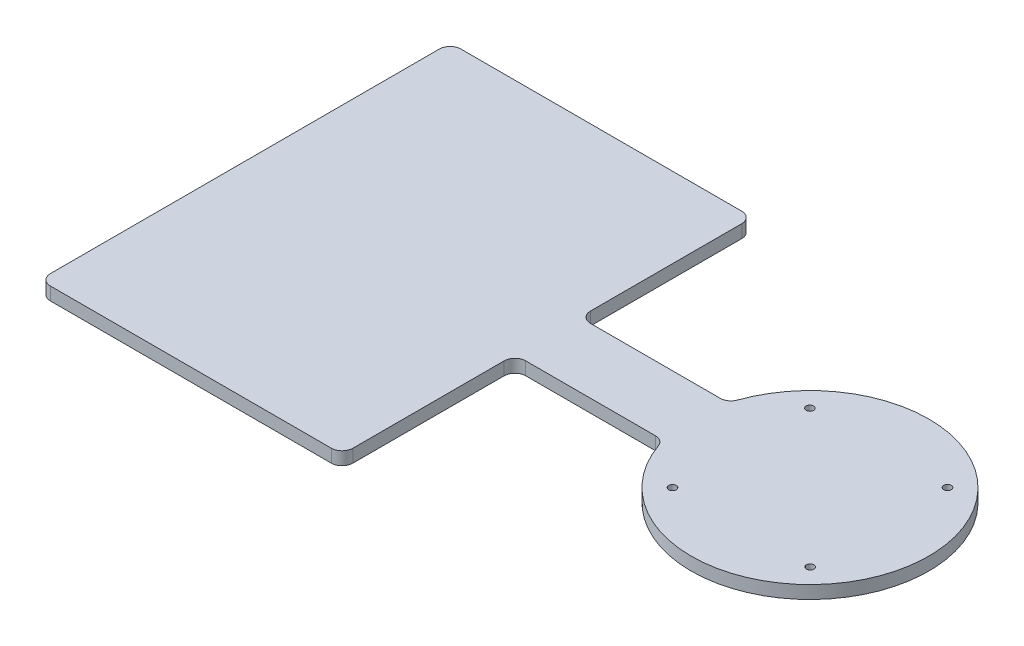
ISO-10303-21;
HEADER;
FILE_DESCRIPTION(('STEP AP214'),'2;1');
FILE_NAME('part.step','',(''),(''),'','','');
FILE_SCHEMA(('AUTOMOTIVE_DESIGN { 1 0 10303 214 1 1 1 1 }'));
ENDSEC;
DATA;
#1=APPLICATION_CONTEXT('core data for automotive mechanical design processes');
#2=APPLICATION_PROTOCOL_DEFINITION('international standard','automotive_design',2000,#1);
#3=PRODUCT_CONTEXT('',#1,'mechanical');
#4=PRODUCT('Part','Part','',(#3));
#5=PRODUCT_RELATED_PRODUCT_CATEGORY('part','',(#4));
#6=PRODUCT_DEFINITION_FORMATION('','',#4);
#7=PRODUCT_DEFINITION_CONTEXT('part definition',#1,'design');
#8=PRODUCT_DEFINITION('design','',#6,#7);
#9=PRODUCT_DEFINITION_SHAPE('','',#8);
#10=(LENGTH_UNIT() NAMED_UNIT(*) SI_UNIT(.MILLI.,.METRE.));
#11=(NAMED_UNIT(*) PLANE_ANGLE_UNIT() SI_UNIT($,.RADIAN.));
#12=(NAMED_UNIT(*) SI_UNIT($,.STERADIAN.) SOLID_ANGLE_UNIT());
#13=UNCERTAINTY_MEASURE_WITH_UNIT(LENGTH_MEASURE(1.E-05),#10,'distance_accuracy_value','');
#14=(GEOMETRIC_REPRESENTATION_CONTEXT(3) GLOBAL_UNCERTAINTY_ASSIGNED_CONTEXT((#13)) GLOBAL_UNIT_ASSIGNED_CONTEXT((#10,
#11,#12)) REPRESENTATION_CONTEXT('',''));
#15=CARTESIAN_POINT('',(0.,0.,0.));
#16=DIRECTION('',(0.,0.,1.));
#17=DIRECTION('',(1.,0.,0.));
#18=AXIS2_PLACEMENT_3D('',#15,#16,#17);
#19=CARTESIAN_POINT('',(-56.568542494923,6.,-19.9999999999996));
#20=DIRECTION('',(0.,-1.,0.));
#21=DIRECTION('',(0.,0.,-1.));
#22=AXIS2_PLACEMENT_3D('',#19,#20,#21);
#23=PLANE('',#22);
#24=CARTESIAN_POINT('',(-56.568542494923,6.,-19.9999999999996));
#25=DIRECTION('',(0.,-1.,0.));
#26=DIRECTION('',(0.,0.,-1.));
#27=AXIS2_PLACEMENT_3D('',#24,#25,#26);
#28=CIRCLE('',#27,5.);
#29=CARTESIAN_POINT('',(-51.8544972870131,6.,-18.3333333333331));
#30=VERTEX_POINT('',#29);
#31=CARTESIAN_POINT('',(-56.568542494923,6.,-14.9999999999996));
#32=VERTEX_POINT('',#31);
#33=EDGE_CURVE('E213',#30,#32,#28,.T.);
#34=ORIENTED_EDGE('',*,*,#33,.T.);
#35=DIRECTION('',(-1.,0.,0.));
#36=VECTOR('',#35,1.);
#37=CARTESIAN_POINT('',(-56.568542494923,6.,-14.9999999999996));
#38=LINE('',#37,#36);
#39=CARTESIAN_POINT('',(-116.568542494924,6.,-14.9999999999992));
#40=VERTEX_POINT('',#39);
#41=EDGE_CURVE('E121',#32,#40,#38,.T.);
#42=ORIENTED_EDGE('',*,*,#41,.T.);
#43=CARTESIAN_POINT('',(-116.568542494924,6.,-19.9999999999992));
#44=DIRECTION('',(0.,-1.,0.));
#45=DIRECTION('',(0.,0.,1.));
#46=AXIS2_PLACEMENT_3D('',#43,#44,#45);
#47=CIRCLE('',#46,5.);
#48=CARTESIAN_POINT('',(-121.568542494924,6.,-19.9999999999991));
#49=VERTEX_POINT('',#48);
#50=EDGE_CURVE('E252',#40,#49,#47,.T.);
#51=ORIENTED_EDGE('',*,*,#50,.T.);
#52=DIRECTION('',(0.,0.,-1.));
#53=VECTOR('',#52,1.);
#54=CARTESIAN_POINT('',(-121.568542494924,6.,-19.9999999999991));
#55=LINE('',#54,#53);
#56=CARTESIAN_POINT('',(-121.568542494924,6.,-89.9999999999991));
#57=VERTEX_POINT('',#56);
#58=EDGE_CURVE('E271',#49,#57,#55,.T.);
#59=ORIENTED_EDGE('',*,*,#58,.T.);
#60=CARTESIAN_POINT('',(-126.568542494924,6.,-89.9999999999991));
#61=DIRECTION('',(0.,1.,0.));
#62=DIRECTION('',(0.,0.,-1.));
#63=AXIS2_PLACEMENT_3D('',#60,#61,#62);
#64=CIRCLE('',#63,5.);
#65=CARTESIAN_POINT('',(-126.568542494924,6.,-94.9999999999991));
#66=VERTEX_POINT('',#65);
#67=EDGE_CURVE('E268',#57,#66,#64,.T.);
#68=ORIENTED_EDGE('',*,*,#67,.T.);
#69=DIRECTION('',(-1.,0.,0.));
#70=VECTOR('',#69,1.);
#71=CARTESIAN_POINT('',(-126.568542494924,6.,-94.9999999999991));
#72=LINE('',#71,#70);
#73=CARTESIAN_POINT('',(-256.568542494924,6.,-94.9999999999982));
#74=VERTEX_POINT('',#73);
#75=EDGE_CURVE('E270',#66,#74,#72,.T.);
#76=ORIENTED_EDGE('',*,*,#75,.T.);
#77=CARTESIAN_POINT('',(-256.568542494924,6.,-89.9999999999982));
#78=DIRECTION('',(0.,1.,0.));
#79=DIRECTION('',(0.,0.,1.));
#80=AXIS2_PLACEMENT_3D('',#77,#78,#79);
#81=CIRCLE('',#80,5.);
#82=CARTESIAN_POINT('',(-261.568542494924,6.,-89.9999999999982));
#83=VERTEX_POINT('',#82);
#84=EDGE_CURVE('E273',#74,#83,#81,.T.);
#85=ORIENTED_EDGE('',*,*,#84,.T.);
#86=DIRECTION('',(0.,0.,1.));
#87=VECTOR('',#86,1.);
#88=CARTESIAN_POINT('',(-261.568542494923,6.,90.0000000000018));
#89=LINE('',#88,#87);
#90=CARTESIAN_POINT('',(-261.568542494923,6.,90.0000000000018));
#91=VERTEX_POINT('',#90);
#92=EDGE_CURVE('E279',#83,#91,#89,.T.);
#93=ORIENTED_EDGE('',*,*,#92,.T.);
#94=CARTESIAN_POINT('',(-256.568542494923,6.,90.0000000000018));
#95=DIRECTION('',(0.,1.,0.));
#96=DIRECTION('',(0.,0.,-1.));
#97=AXIS2_PLACEMENT_3D('',#94,#95,#96);
#98=CIRCLE('',#97,5.);
#99=CARTESIAN_POINT('',(-256.568542494923,6.,95.0000000000018));
#100=VERTEX_POINT('',#99);
#101=EDGE_CURVE('E281',#91,#100,#98,.T.);
#102=ORIENTED_EDGE('',*,*,#101,.T.);
#103=DIRECTION('',(1.,0.,0.));
#104=VECTOR('',#103,1.);
#105=CARTESIAN_POINT('',(-126.568542494923,6.,95.));
#106=LINE('',#105,#104);
#107=CARTESIAN_POINT('',(-126.568542494923,6.,95.0000000000004));
#108=VERTEX_POINT('',#107);
#109=EDGE_CURVE('E283',#100,#108,#106,.T.);
#110=ORIENTED_EDGE('',*,*,#109,.T.);
#111=CARTESIAN_POINT('',(-126.568542494923,6.,90.0000000000009));
#112=DIRECTION('',(0.,1.,0.));
#113=DIRECTION('',(0.,0.,1.));
#114=AXIS2_PLACEMENT_3D('',#111,#112,#113);
#115=CIRCLE('',#114,4.99999999999954);
#116=CARTESIAN_POINT('',(-121.568542494923,6.,90.));
#117=VERTEX_POINT('',#116);
#118=EDGE_CURVE('E285',#108,#117,#115,.T.);
#119=ORIENTED_EDGE('',*,*,#118,.T.);
#120=DIRECTION('',(0.,0.,-1.));
#121=VECTOR('',#120,1.);
#122=CARTESIAN_POINT('',(-121.568542494924,6.,20.));
#123=LINE('',#122,#121);
#124=CARTESIAN_POINT('',(-121.568542494924,6.,20.));
#125=VERTEX_POINT('',#124);
#126=EDGE_CURVE('E287',#117,#125,#123,.T.);
#127=ORIENTED_EDGE('',*,*,#126,.T.);
#128=CARTESIAN_POINT('',(-116.568542494924,6.,20.0000000000008));
#129=DIRECTION('',(0.,-1.,0.));
#130=DIRECTION('',(0.,0.,-1.));
#131=AXIS2_PLACEMENT_3D('',#128,#129,#130);
#132=CIRCLE('',#131,5.);
#133=CARTESIAN_POINT('',(-116.568542494924,6.,15.0000000000008));
#134=VERTEX_POINT('',#133);
#135=EDGE_CURVE('E164',#125,#134,#132,.T.);
#136=ORIENTED_EDGE('',*,*,#135,.T.);
#137=DIRECTION('',(1.,0.,0.));
#138=VECTOR('',#137,1.);
#139=CARTESIAN_POINT('',(-56.5685424949237,6.,15.0000000000004));
#140=LINE('',#139,#138);
#141=CARTESIAN_POINT('',(-56.5685424949237,6.,15.0000000000004));
#142=VERTEX_POINT('',#141);
#143=EDGE_CURVE('E158',#134,#142,#140,.T.);
#144=ORIENTED_EDGE('',*,*,#143,.T.);
#145=CARTESIAN_POINT('',(-56.5685424949237,6.,20.0000000000004));
#146=DIRECTION('',(0.,-1.,0.));
#147=DIRECTION('',(0.,0.,1.));
#148=AXIS2_PLACEMENT_3D('',#145,#146,#147);
#149=CIRCLE('',#148,5.);
#150=CARTESIAN_POINT('',(-51.854497287013,6.,18.3333333333335));
#151=VERTEX_POINT('',#150);
#152=EDGE_CURVE('E162',#142,#151,#149,.T.);
#153=ORIENTED_EDGE('',*,*,#152,.T.);
#154=CARTESIAN_POINT('',(0.,6.,0.));
#155=DIRECTION('',(0.,1.,0.));
#156=DIRECTION('',(0.,0.,1.));
#157=AXIS2_PLACEMENT_3D('',#154,#155,#156);
#158=CIRCLE('',#157,54.9999999999996);
#159=EDGE_CURVE('E54',#151,#30,#158,.T.);
#160=ORIENTED_EDGE('',*,*,#159,.T.);
#161=EDGE_LOOP('',(#34,#42,#51,#59,#68,#76,#85,#93,#102,#110,#119,#127,#136,#144,#153,#160));
#162=FACE_BOUND('',#161,.T.);
#163=CARTESIAN_POINT('',(31.8512721961785,6.,31.7883069616007));
#164=DIRECTION('',(0.,1.,0.));
#165=DIRECTION('',(0.,0.,1.));
#166=AXIS2_PLACEMENT_3D('',#163,#164,#165);
#167=CIRCLE('',#166,1.75);
#168=CARTESIAN_POINT('',(31.8512721961785,6.,33.5383069616007));
#169=VERTEX_POINT('',#168);
#170=EDGE_CURVE('E186',#169,#169,#167,.T.);
#171=ORIENTED_EDGE('',*,*,#170,.F.);
#172=EDGE_LOOP('',(#171));
#173=FACE_BOUND('',#172,.T.);
#174=CARTESIAN_POINT('',(31.788306961597,6.,-31.8512721961785));
#175=DIRECTION('',(0.,1.,0.));
#176=DIRECTION('',(0.,0.,1.));
#177=AXIS2_PLACEMENT_3D('',#174,#175,#176);
#178=CIRCLE('',#177,1.75000000000093);
#179=CARTESIAN_POINT('',(31.788306961597,6.,-30.1012721961775));
#180=VERTEX_POINT('',#179);
#181=EDGE_CURVE('E351',#180,#180,#178,.T.);
#182=ORIENTED_EDGE('',*,*,#181,.F.);
#183=EDGE_LOOP('',(#182));
#184=FACE_BOUND('',#183,.T.);
#185=CARTESIAN_POINT('',(-31.8512721961821,6.,-31.788306961597));
#186=DIRECTION('',(0.,1.,0.));
#187=DIRECTION('',(0.,0.,1.));
#188=AXIS2_PLACEMENT_3D('',#185,#186,#187);
#189=CIRCLE('',#188,1.75000000000425);
#190=CARTESIAN_POINT('',(-31.8512721961821,6.,-30.0383069615928));
#191=VERTEX_POINT('',#190);
#192=EDGE_CURVE('E345',#191,#191,#189,.T.);
#193=ORIENTED_EDGE('',*,*,#192,.F.);
#194=EDGE_LOOP('',(#193));
#195=FACE_BOUND('',#194,.T.);
#196=CARTESIAN_POINT('',(-31.7883069616007,6.,31.8512721961821));
#197=DIRECTION('',(0.,1.,0.));
#198=DIRECTION('',(0.,0.,1.));
#199=AXIS2_PLACEMENT_3D('',#196,#197,#198);
#200=CIRCLE('',#199,1.75000000000306);
#201=CARTESIAN_POINT('',(-31.7883069616007,6.,33.6012721961851));
#202=VERTEX_POINT('',#201);
#203=EDGE_CURVE('E336',#202,#202,#200,.T.);
#204=ORIENTED_EDGE('',*,*,#203,.F.);
#205=EDGE_LOOP('',(#204));
#206=FACE_BOUND('',#205,.T.);
#207=ADVANCED_FACE('F37',(#162,#173,#184,#195,#206),#23,.F.);
#208=CARTESIAN_POINT('',(-56.568542494923,0.,-19.9999999999996));
#209=DIRECTION('',(0.,-1.,0.));
#210=DIRECTION('',(0.,0.,-1.));
#211=AXIS2_PLACEMENT_3D('',#208,#209,#210);
#212=PLANE('',#211);
#213=CARTESIAN_POINT('',(-31.8512721961821,0.,-31.788306961597));
#214=DIRECTION('',(0.,1.,0.));
#215=DIRECTION('',(0.,0.,1.));
#216=AXIS2_PLACEMENT_3D('',#213,#214,#215);
#217=CIRCLE('',#216,1.75000000000425);
#218=CARTESIAN_POINT('',(-31.8512721961821,0.,-30.0383069615928));
#219=VERTEX_POINT('',#218);
#220=EDGE_CURVE('E342',#219,#219,#217,.T.);
#221=ORIENTED_EDGE('',*,*,#220,.T.);
#222=EDGE_LOOP('',(#221));
#223=FACE_BOUND('',#222,.T.);
#224=CARTESIAN_POINT('',(31.8512721961785,0.,31.7883069616007));
#225=DIRECTION('',(0.,1.,0.));
#226=DIRECTION('',(0.,0.,1.));
#227=AXIS2_PLACEMENT_3D('',#224,#225,#226);
#228=CIRCLE('',#227,1.75);
#229=CARTESIAN_POINT('',(31.8512721961785,0.,33.5383069616007));
#230=VERTEX_POINT('',#229);
#231=EDGE_CURVE('E354',#230,#230,#228,.T.);
#232=ORIENTED_EDGE('',*,*,#231,.T.);
#233=EDGE_LOOP('',(#232));
#234=FACE_BOUND('',#233,.T.);
#235=CARTESIAN_POINT('',(-56.568542494923,0.,-19.9999999999996));
#236=DIRECTION('',(0.,-1.,0.));
#237=DIRECTION('',(0.,0.,-1.));
#238=AXIS2_PLACEMENT_3D('',#235,#236,#237);
#239=CIRCLE('',#238,5.);
#240=CARTESIAN_POINT('',(-51.8544972870131,0.,-18.3333333333331));
#241=VERTEX_POINT('',#240);
#242=CARTESIAN_POINT('',(-56.568542494923,0.,-14.9999999999996));
#243=VERTEX_POINT('',#242);
#244=EDGE_CURVE('E182',#241,#243,#239,.T.);
#245=ORIENTED_EDGE('',*,*,#244,.F.);
#246=CARTESIAN_POINT('',(0.,0.,0.));
#247=DIRECTION('',(0.,1.,0.));
#248=DIRECTION('',(0.,0.,1.));
#249=AXIS2_PLACEMENT_3D('',#246,#247,#248);
#250=CIRCLE('',#249,54.9999999999996);
#251=CARTESIAN_POINT('',(-51.854497287013,0.,18.3333333333335));
#252=VERTEX_POINT('',#251);
#253=EDGE_CURVE('E113',#252,#241,#250,.T.);
#254=ORIENTED_EDGE('',*,*,#253,.F.);
#255=CARTESIAN_POINT('',(-56.5685424949237,0.,20.0000000000004));
#256=DIRECTION('',(0.,-1.,0.));
#257=DIRECTION('',(0.,0.,1.));
#258=AXIS2_PLACEMENT_3D('',#255,#256,#257);
#259=CIRCLE('',#258,5.);
#260=CARTESIAN_POINT('',(-56.5685424949237,0.,15.0000000000004));
#261=VERTEX_POINT('',#260);
#262=EDGE_CURVE('E107',#261,#252,#259,.T.);
#263=ORIENTED_EDGE('',*,*,#262,.F.);
#264=DIRECTION('',(1.,0.,0.));
#265=VECTOR('',#264,1.);
#266=CARTESIAN_POINT('',(-56.5685424949237,0.,15.0000000000004));
#267=LINE('',#266,#265);
#268=CARTESIAN_POINT('',(-116.568542494924,0.,15.0000000000008));
#269=VERTEX_POINT('',#268);
#270=EDGE_CURVE('E172',#269,#261,#267,.T.);
#271=ORIENTED_EDGE('',*,*,#270,.F.);
#272=CARTESIAN_POINT('',(-116.568542494924,0.,20.0000000000008));
#273=DIRECTION('',(0.,-1.,0.));
#274=DIRECTION('',(0.,0.,-1.));
#275=AXIS2_PLACEMENT_3D('',#272,#273,#274);
#276=CIRCLE('',#275,5.);
#277=CARTESIAN_POINT('',(-121.568542494924,0.,20.));
#278=VERTEX_POINT('',#277);
#279=EDGE_CURVE('E208',#278,#269,#276,.T.);
#280=ORIENTED_EDGE('',*,*,#279,.F.);
#281=DIRECTION('',(0.,0.,-1.));
#282=VECTOR('',#281,1.);
#283=CARTESIAN_POINT('',(-121.568542494924,0.,20.));
#284=LINE('',#283,#282);
#285=CARTESIAN_POINT('',(-121.568542494923,0.,90.));
#286=VERTEX_POINT('',#285);
#287=EDGE_CURVE('E206',#286,#278,#284,.T.);
#288=ORIENTED_EDGE('',*,*,#287,.F.);
#289=CARTESIAN_POINT('',(-126.568542494923,0.,90.0000000000009));
#290=DIRECTION('',(0.,1.,0.));
#291=DIRECTION('',(0.,0.,1.));
#292=AXIS2_PLACEMENT_3D('',#289,#290,#291);
#293=CIRCLE('',#292,4.99999999999954);
#294=CARTESIAN_POINT('',(-126.568542494923,0.,95.0000000000004));
#295=VERTEX_POINT('',#294);
#296=EDGE_CURVE('E204',#295,#286,#293,.T.);
#297=ORIENTED_EDGE('',*,*,#296,.F.);
#298=DIRECTION('',(1.,0.,0.));
#299=VECTOR('',#298,1.);
#300=CARTESIAN_POINT('',(-126.568542494923,0.,95.));
#301=LINE('',#300,#299);
#302=CARTESIAN_POINT('',(-256.568542494923,0.,95.0000000000018));
#303=VERTEX_POINT('',#302);
#304=EDGE_CURVE('E202',#303,#295,#301,.T.);
#305=ORIENTED_EDGE('',*,*,#304,.F.);
#306=CARTESIAN_POINT('',(-256.568542494923,0.,90.0000000000018));
#307=DIRECTION('',(0.,1.,0.));
#308=DIRECTION('',(0.,0.,-1.));
#309=AXIS2_PLACEMENT_3D('',#306,#307,#308);
#310=CIRCLE('',#309,5.);
#311=CARTESIAN_POINT('',(-261.568542494923,0.,90.0000000000018));
#312=VERTEX_POINT('',#311);
#313=EDGE_CURVE('E200',#312,#303,#310,.T.);
#314=ORIENTED_EDGE('',*,*,#313,.F.);
#315=DIRECTION('',(0.,0.,1.));
#316=VECTOR('',#315,1.);
#317=CARTESIAN_POINT('',(-261.568542494923,0.,90.0000000000018));
#318=LINE('',#317,#316);
#319=CARTESIAN_POINT('',(-261.568542494924,0.,-89.9999999999982));
#320=VERTEX_POINT('',#319);
#321=EDGE_CURVE('E198',#320,#312,#318,.T.);
#322=ORIENTED_EDGE('',*,*,#321,.F.);
#323=CARTESIAN_POINT('',(-256.568542494924,0.,-89.9999999999982));
#324=DIRECTION('',(0.,1.,0.));
#325=DIRECTION('',(0.,0.,1.));
#326=AXIS2_PLACEMENT_3D('',#323,#324,#325);
#327=CIRCLE('',#326,5.);
#328=CARTESIAN_POINT('',(-256.568542494924,0.,-94.9999999999982));
#329=VERTEX_POINT('',#328);
#330=EDGE_CURVE('E196',#329,#320,#327,.T.);
#331=ORIENTED_EDGE('',*,*,#330,.F.);
#332=DIRECTION('',(-1.,0.,0.));
#333=VECTOR('',#332,1.);
#334=CARTESIAN_POINT('',(-126.568542494924,0.,-94.9999999999991));
#335=LINE('',#334,#333);
#336=CARTESIAN_POINT('',(-126.568542494924,0.,-94.9999999999991));
#337=VERTEX_POINT('',#336);
#338=EDGE_CURVE('E194',#337,#329,#335,.T.);
#339=ORIENTED_EDGE('',*,*,#338,.F.);
#340=CARTESIAN_POINT('',(-126.568542494924,0.,-89.9999999999991));
#341=DIRECTION('',(0.,1.,0.));
#342=DIRECTION('',(0.,0.,-1.));
#343=AXIS2_PLACEMENT_3D('',#340,#341,#342);
#344=CIRCLE('',#343,5.);
#345=CARTESIAN_POINT('',(-121.568542494924,0.,-89.9999999999991));
#346=VERTEX_POINT('',#345);
#347=EDGE_CURVE('E192',#346,#337,#344,.T.);
#348=ORIENTED_EDGE('',*,*,#347,.F.);
#349=DIRECTION('',(0.,0.,-1.));
#350=VECTOR('',#349,1.);
#351=CARTESIAN_POINT('',(-121.568542494924,0.,-19.9999999999991));
#352=LINE('',#351,#350);
#353=CARTESIAN_POINT('',(-121.568542494924,0.,-19.9999999999991));
#354=VERTEX_POINT('',#353);
#355=EDGE_CURVE('E190',#354,#346,#352,.T.);
#356=ORIENTED_EDGE('',*,*,#355,.F.);
#357=CARTESIAN_POINT('',(-116.568542494924,0.,-19.9999999999992));
#358=DIRECTION('',(0.,-1.,0.));
#359=DIRECTION('',(0.,0.,1.));
#360=AXIS2_PLACEMENT_3D('',#357,#358,#359);
#361=CIRCLE('',#360,5.);
#362=CARTESIAN_POINT('',(-116.568542494924,0.,-14.9999999999992));
#363=VERTEX_POINT('',#362);
#364=EDGE_CURVE('E188',#363,#354,#361,.T.);
#365=ORIENTED_EDGE('',*,*,#364,.F.);
#366=DIRECTION('',(-1.,0.,0.));
#367=VECTOR('',#366,1.);
#368=CARTESIAN_POINT('',(-56.568542494923,0.,-14.9999999999996));
#369=LINE('',#368,#367);
#370=EDGE_CURVE('E185',#243,#363,#369,.T.);
#371=ORIENTED_EDGE('',*,*,#370,.F.);
#372=EDGE_LOOP('',(#245,#254,#263,#271,#280,#288,#297,#305,#314,#322,#331,#339,#348,#356,#365,#371));
#373=FACE_BOUND('',#372,.T.);
#374=CARTESIAN_POINT('',(31.788306961597,0.,-31.8512721961785));
#375=DIRECTION('',(0.,1.,0.));
#376=DIRECTION('',(0.,0.,1.));
#377=AXIS2_PLACEMENT_3D('',#374,#375,#376);
#378=CIRCLE('',#377,1.75000000000093);
#379=CARTESIAN_POINT('',(31.788306961597,0.,-30.1012721961775));
#380=VERTEX_POINT('',#379);
#381=EDGE_CURVE('E348',#380,#380,#378,.T.);
#382=ORIENTED_EDGE('',*,*,#381,.T.);
#383=EDGE_LOOP('',(#382));
#384=FACE_BOUND('',#383,.T.);
#385=CARTESIAN_POINT('',(-31.7883069616007,0.,31.8512721961821));
#386=DIRECTION('',(0.,1.,0.));
#387=DIRECTION('',(0.,0.,1.));
#388=AXIS2_PLACEMENT_3D('',#385,#386,#387);
#389=CIRCLE('',#388,1.75000000000306);
#390=CARTESIAN_POINT('',(-31.7883069616007,0.,33.6012721961851));
#391=VERTEX_POINT('',#390);
#392=EDGE_CURVE('E339',#391,#391,#389,.T.);
#393=ORIENTED_EDGE('',*,*,#392,.T.);
#394=EDGE_LOOP('',(#393));
#395=FACE_BOUND('',#394,.T.);
#396=ADVANCED_FACE('F256',(#223,#234,#373,#384,#395),#212,.T.);
#397=CARTESIAN_POINT('',(-56.568542494923,6.,-19.9999999999996));
#398=DIRECTION('',(0.,-1.,0.));
#399=DIRECTION('',(0.,0.,-1.));
#400=AXIS2_PLACEMENT_3D('',#397,#398,#399);
#401=CYLINDRICAL_SURFACE('',#400,5.);
#402=ORIENTED_EDGE('',*,*,#244,.T.);
#403=DIRECTION('',(0.,-1.,0.));
#404=VECTOR('',#403,1.);
#405=CARTESIAN_POINT('',(-56.568542494923,6.,-14.9999999999996));
#406=LINE('',#405,#404);
#407=EDGE_CURVE('E11',#32,#243,#406,.T.);
#408=ORIENTED_EDGE('',*,*,#407,.F.);
#409=ORIENTED_EDGE('',*,*,#33,.F.);
#410=DIRECTION('',(0.,-1.,0.));
#411=VECTOR('',#410,1.);
#412=CARTESIAN_POINT('',(-51.8544972870131,6.,-18.3333333333331));
#413=LINE('',#412,#411);
#414=EDGE_CURVE('E178',#30,#241,#413,.T.);
#415=ORIENTED_EDGE('',*,*,#414,.T.);
#416=EDGE_LOOP('',(#402,#408,#409,#415));
#417=FACE_BOUND('',#416,.T.);
#418=ADVANCED_FACE('F39',(#417),#401,.F.);
#419=CARTESIAN_POINT('',(-56.568542494923,6.,-14.9999999999996));
#420=DIRECTION('',(0.,0.,1.));
#421=DIRECTION('',(1.,0.,0.));
#422=AXIS2_PLACEMENT_3D('',#419,#420,#421);
#423=PLANE('',#422);
#424=ORIENTED_EDGE('',*,*,#370,.T.);
#425=DIRECTION('',(0.,-1.,0.));
#426=VECTOR('',#425,1.);
#427=CARTESIAN_POINT('',(-116.568542494924,6.,-14.9999999999992));
#428=LINE('',#427,#426);
#429=EDGE_CURVE('E46',#40,#363,#428,.T.);
#430=ORIENTED_EDGE('',*,*,#429,.F.);
#431=ORIENTED_EDGE('',*,*,#41,.F.);
#432=ORIENTED_EDGE('',*,*,#407,.T.);
#433=EDGE_LOOP('',(#424,#430,#431,#432));
#434=FACE_BOUND('',#433,.T.);
#435=ADVANCED_FACE('F520',(#434),#423,.F.);
#436=CARTESIAN_POINT('',(-116.568542494924,6.,-19.9999999999992));
#437=DIRECTION('',(0.,-1.,0.));
#438=DIRECTION('',(0.,0.,-1.));
#439=AXIS2_PLACEMENT_3D('',#436,#437,#438);
#440=CYLINDRICAL_SURFACE('',#439,5.);
#441=ORIENTED_EDGE('',*,*,#364,.T.);
#442=DIRECTION('',(0.,-1.,0.));
#443=VECTOR('',#442,1.);
#444=CARTESIAN_POINT('',(-121.568542494924,6.,-19.9999999999991));
#445=LINE('',#444,#443);
#446=EDGE_CURVE('E244',#49,#354,#445,.T.);
#447=ORIENTED_EDGE('',*,*,#446,.F.);
#448=ORIENTED_EDGE('',*,*,#50,.F.);
#449=ORIENTED_EDGE('',*,*,#429,.T.);
#450=EDGE_LOOP('',(#441,#447,#448,#449));
#451=FACE_BOUND('',#450,.T.);
#452=ADVANCED_FACE('F250',(#451),#440,.F.);
#453=CARTESIAN_POINT('',(-121.568542494924,6.,-19.9999999999991));
#454=DIRECTION('',(-1.,0.,0.));
#455=DIRECTION('',(0.,0.,1.));
#456=AXIS2_PLACEMENT_3D('',#453,#454,#455);
#457=PLANE('',#456);
#458=ORIENTED_EDGE('',*,*,#355,.T.);
#459=DIRECTION('',(0.,-1.,0.));
#460=VECTOR('',#459,1.);
#461=CARTESIAN_POINT('',(-121.568542494924,6.,-89.9999999999991));
#462=LINE('',#461,#460);
#463=EDGE_CURVE('E241',#57,#346,#462,.T.);
#464=ORIENTED_EDGE('',*,*,#463,.F.);
#465=ORIENTED_EDGE('',*,*,#58,.F.);
#466=ORIENTED_EDGE('',*,*,#446,.T.);
#467=EDGE_LOOP('',(#458,#464,#465,#466));
#468=FACE_BOUND('',#467,.T.);
#469=ADVANCED_FACE('F262',(#468),#457,.F.);
#470=CARTESIAN_POINT('',(-126.568542494924,6.,-89.9999999999991));
#471=DIRECTION('',(0.,-1.,0.));
#472=DIRECTION('',(0.,0.,-1.));
#473=AXIS2_PLACEMENT_3D('',#470,#471,#472);
#474=CYLINDRICAL_SURFACE('',#473,5.);
#475=ORIENTED_EDGE('',*,*,#347,.T.);
#476=DIRECTION('',(0.,-1.,0.));
#477=VECTOR('',#476,1.);
#478=CARTESIAN_POINT('',(-126.568542494924,6.,-94.9999999999991));
#479=LINE('',#478,#477);
#480=EDGE_CURVE('E238',#66,#337,#479,.T.);
#481=ORIENTED_EDGE('',*,*,#480,.F.);
#482=ORIENTED_EDGE('',*,*,#67,.F.);
#483=ORIENTED_EDGE('',*,*,#463,.T.);
#484=EDGE_LOOP('',(#475,#481,#482,#483));
#485=FACE_BOUND('',#484,.T.);
#486=ADVANCED_FACE('F266',(#485),#474,.T.);
#487=CARTESIAN_POINT('',(-126.568542494924,6.,-94.9999999999991));
#488=DIRECTION('',(0.,0.,1.));
#489=DIRECTION('',(1.,0.,0.));
#490=AXIS2_PLACEMENT_3D('',#487,#488,#489);
#491=PLANE('',#490);
#492=ORIENTED_EDGE('',*,*,#338,.T.);
#493=DIRECTION('',(0.,-1.,0.));
#494=VECTOR('',#493,1.);
#495=CARTESIAN_POINT('',(-256.568542494924,6.,-94.9999999999982));
#496=LINE('',#495,#494);
#497=EDGE_CURVE('E235',#74,#329,#496,.T.);
#498=ORIENTED_EDGE('',*,*,#497,.F.);
#499=ORIENTED_EDGE('',*,*,#75,.F.);
#500=ORIENTED_EDGE('',*,*,#480,.T.);
#501=EDGE_LOOP('',(#492,#498,#499,#500));
#502=FACE_BOUND('',#501,.T.);
#503=ADVANCED_FACE('F481',(#502),#491,.F.);
#504=CARTESIAN_POINT('',(-256.568542494924,6.,-89.9999999999982));
#505=DIRECTION('',(0.,-1.,0.));
#506=DIRECTION('',(0.,0.,-1.));
#507=AXIS2_PLACEMENT_3D('',#504,#505,#506);
#508=CYLINDRICAL_SURFACE('',#507,5.);
#509=ORIENTED_EDGE('',*,*,#330,.T.);
#510=DIRECTION('',(0.,-1.,0.));
#511=VECTOR('',#510,1.);
#512=CARTESIAN_POINT('',(-261.568542494924,6.,-89.9999999999982));
#513=LINE('',#512,#511);
#514=EDGE_CURVE('E232',#83,#320,#513,.T.);
#515=ORIENTED_EDGE('',*,*,#514,.F.);
#516=ORIENTED_EDGE('',*,*,#84,.F.);
#517=ORIENTED_EDGE('',*,*,#497,.T.);
#518=EDGE_LOOP('',(#509,#515,#516,#517));
#519=FACE_BOUND('',#518,.T.);
#520=ADVANCED_FACE('F470',(#519),#508,.T.);
#521=CARTESIAN_POINT('',(-261.568542494923,6.,90.0000000000018));
#522=DIRECTION('',(1.,0.,0.));
#523=DIRECTION('',(0.,0.,-1.));
#524=AXIS2_PLACEMENT_3D('',#521,#522,#523);
#525=PLANE('',#524);
#526=ORIENTED_EDGE('',*,*,#321,.T.);
#527=DIRECTION('',(0.,-1.,0.));
#528=VECTOR('',#527,1.);
#529=CARTESIAN_POINT('',(-261.568542494923,6.,90.0000000000018));
#530=LINE('',#529,#528);
#531=EDGE_CURVE('E229',#91,#312,#530,.T.);
#532=ORIENTED_EDGE('',*,*,#531,.F.);
#533=ORIENTED_EDGE('',*,*,#92,.F.);
#534=ORIENTED_EDGE('',*,*,#514,.T.);
#535=EDGE_LOOP('',(#526,#532,#533,#534));
#536=FACE_BOUND('',#535,.T.);
#537=ADVANCED_FACE('F459',(#536),#525,.F.);
#538=CARTESIAN_POINT('',(-256.568542494923,6.,90.0000000000018));
#539=DIRECTION('',(0.,-1.,0.));
#540=DIRECTION('',(0.,0.,-1.));
#541=AXIS2_PLACEMENT_3D('',#538,#539,#540);
#542=CYLINDRICAL_SURFACE('',#541,5.);
#543=ORIENTED_EDGE('',*,*,#313,.T.);
#544=DIRECTION('',(0.,-1.,0.));
#545=VECTOR('',#544,1.);
#546=CARTESIAN_POINT('',(-256.568542494923,6.,95.0000000000018));
#547=LINE('',#546,#545);
#548=EDGE_CURVE('E226',#100,#303,#547,.T.);
#549=ORIENTED_EDGE('',*,*,#548,.F.);
#550=ORIENTED_EDGE('',*,*,#101,.F.);
#551=ORIENTED_EDGE('',*,*,#531,.T.);
#552=EDGE_LOOP('',(#543,#549,#550,#551));
#553=FACE_BOUND('',#552,.T.);
#554=ADVANCED_FACE('F448',(#553),#542,.T.);
#555=CARTESIAN_POINT('',(-126.568542494923,6.,95.));
#556=DIRECTION('',(0.,0.,-1.));
#557=DIRECTION('',(-1.,0.,0.));
#558=AXIS2_PLACEMENT_3D('',#555,#556,#557);
#559=PLANE('',#558);
#560=ORIENTED_EDGE('',*,*,#304,.T.);
#561=DIRECTION('',(0.,-1.,0.));
#562=VECTOR('',#561,1.);
#563=CARTESIAN_POINT('',(-126.568542494923,6.,95.0000000000004));
#564=LINE('',#563,#562);
#565=EDGE_CURVE('E223',#108,#295,#564,.T.);
#566=ORIENTED_EDGE('',*,*,#565,.F.);
#567=ORIENTED_EDGE('',*,*,#109,.F.);
#568=ORIENTED_EDGE('',*,*,#548,.T.);
#569=EDGE_LOOP('',(#560,#566,#567,#568));
#570=FACE_BOUND('',#569,.T.);
#571=ADVANCED_FACE('F437',(#570),#559,.F.);
#572=CARTESIAN_POINT('',(-126.568542494923,6.,90.0000000000009));
#573=DIRECTION('',(0.,-1.,0.));
#574=DIRECTION('',(0.,0.,-1.));
#575=AXIS2_PLACEMENT_3D('',#572,#573,#574);
#576=CYLINDRICAL_SURFACE('',#575,4.99999999999954);
#577=ORIENTED_EDGE('',*,*,#296,.T.);
#578=DIRECTION('',(0.,-1.,0.));
#579=VECTOR('',#578,1.);
#580=CARTESIAN_POINT('',(-121.568542494923,6.,90.));
#581=LINE('',#580,#579);
#582=EDGE_CURVE('E220',#117,#286,#581,.T.);
#583=ORIENTED_EDGE('',*,*,#582,.F.);
#584=ORIENTED_EDGE('',*,*,#118,.F.);
#585=ORIENTED_EDGE('',*,*,#565,.T.);
#586=EDGE_LOOP('',(#577,#583,#584,#585));
#587=FACE_BOUND('',#586,.T.);
#588=ADVANCED_FACE('F427',(#587),#576,.T.);
#589=CARTESIAN_POINT('',(-121.568542494924,6.,20.));
#590=DIRECTION('',(-1.,0.,0.));
#591=DIRECTION('',(0.,0.,1.));
#592=AXIS2_PLACEMENT_3D('',#589,#590,#591);
#593=PLANE('',#592);
#594=ORIENTED_EDGE('',*,*,#287,.T.);
#595=DIRECTION('',(0.,-1.,0.));
#596=VECTOR('',#595,1.);
#597=CARTESIAN_POINT('',(-121.568542494924,6.,20.));
#598=LINE('',#597,#596);
#599=EDGE_CURVE('E217',#125,#278,#598,.T.);
#600=ORIENTED_EDGE('',*,*,#599,.F.);
#601=ORIENTED_EDGE('',*,*,#126,.F.);
#602=ORIENTED_EDGE('',*,*,#582,.T.);
#603=EDGE_LOOP('',(#594,#600,#601,#602));
#604=FACE_BOUND('',#603,.T.);
#605=ADVANCED_FACE('F293',(#604),#593,.F.);
#606=CARTESIAN_POINT('',(-116.568542494924,6.,20.0000000000008));
#607=DIRECTION('',(0.,-1.,0.));
#608=DIRECTION('',(0.,0.,-1.));
#609=AXIS2_PLACEMENT_3D('',#606,#607,#608);
#610=CYLINDRICAL_SURFACE('',#609,5.);
#611=ORIENTED_EDGE('',*,*,#279,.T.);
#612=DIRECTION('',(0.,-1.,0.));
#613=VECTOR('',#612,1.);
#614=CARTESIAN_POINT('',(-116.568542494924,6.,15.0000000000008));
#615=LINE('',#614,#613);
#616=EDGE_CURVE('E173',#134,#269,#615,.T.);
#617=ORIENTED_EDGE('',*,*,#616,.F.);
#618=ORIENTED_EDGE('',*,*,#135,.F.);
#619=ORIENTED_EDGE('',*,*,#599,.T.);
#620=EDGE_LOOP('',(#611,#617,#618,#619));
#621=FACE_BOUND('',#620,.T.);
#622=ADVANCED_FACE('F297',(#621),#610,.F.);
#623=CARTESIAN_POINT('',(-56.5685424949237,6.,15.0000000000004));
#624=DIRECTION('',(0.,0.,-1.));
#625=DIRECTION('',(-1.,0.,0.));
#626=AXIS2_PLACEMENT_3D('',#623,#624,#625);
#627=PLANE('',#626);
#628=ORIENTED_EDGE('',*,*,#270,.T.);
#629=DIRECTION('',(0.,-1.,0.));
#630=VECTOR('',#629,1.);
#631=CARTESIAN_POINT('',(-56.5685424949237,6.,15.0000000000004));
#632=LINE('',#631,#630);
#633=EDGE_CURVE('E169',#142,#261,#632,.T.);
#634=ORIENTED_EDGE('',*,*,#633,.F.);
#635=ORIENTED_EDGE('',*,*,#143,.F.);
#636=ORIENTED_EDGE('',*,*,#616,.T.);
#637=EDGE_LOOP('',(#628,#634,#635,#636));
#638=FACE_BOUND('',#637,.T.);
#639=ADVANCED_FACE('F170',(#638),#627,.F.);
#640=CARTESIAN_POINT('',(-56.5685424949237,6.,20.0000000000004));
#641=DIRECTION('',(0.,-1.,0.));
#642=DIRECTION('',(0.,0.,-1.));
#643=AXIS2_PLACEMENT_3D('',#640,#641,#642);
#644=CYLINDRICAL_SURFACE('',#643,5.);
#645=ORIENTED_EDGE('',*,*,#262,.T.);
#646=DIRECTION('',(0.,-1.,0.));
#647=VECTOR('',#646,1.);
#648=CARTESIAN_POINT('',(-51.854497287013,6.,18.3333333333335));
#649=LINE('',#648,#647);
#650=EDGE_CURVE('E174',#151,#252,#649,.T.);
#651=ORIENTED_EDGE('',*,*,#650,.F.);
#652=ORIENTED_EDGE('',*,*,#152,.F.);
#653=ORIENTED_EDGE('',*,*,#633,.T.);
#654=EDGE_LOOP('',(#645,#651,#652,#653));
#655=FACE_BOUND('',#654,.T.);
#656=ADVANCED_FACE('F176',(#655),#644,.F.);
#657=CARTESIAN_POINT('',(0.,6.,0.));
#658=DIRECTION('',(0.,-1.,0.));
#659=DIRECTION('',(0.,0.,-1.));
#660=AXIS2_PLACEMENT_3D('',#657,#658,#659);
#661=CYLINDRICAL_SURFACE('',#660,54.9999999999996);
#662=ORIENTED_EDGE('',*,*,#253,.T.);
#663=ORIENTED_EDGE('',*,*,#414,.F.);
#664=ORIENTED_EDGE('',*,*,#159,.F.);
#665=ORIENTED_EDGE('',*,*,#650,.T.);
#666=EDGE_LOOP('',(#662,#663,#664,#665));
#667=FACE_BOUND('',#666,.T.);
#668=ADVANCED_FACE('F301',(#667),#661,.T.);
#669=CARTESIAN_POINT('',(31.8512721961785,6.,31.7883069616007));
#670=DIRECTION('',(0.,-1.,0.));
#671=DIRECTION('',(0.,0.,-1.));
#672=AXIS2_PLACEMENT_3D('',#669,#670,#671);
#673=CYLINDRICAL_SURFACE('',#672,1.75);
#674=ORIENTED_EDGE('',*,*,#170,.T.);
#675=EDGE_LOOP('',(#674));
#676=FACE_BOUND('',#675,.T.);
#677=ORIENTED_EDGE('',*,*,#231,.F.);
#678=EDGE_LOOP('',(#677));
#679=FACE_BOUND('',#678,.T.);
#680=ADVANCED_FACE('F303',(#676,#679),#673,.F.);
#681=CARTESIAN_POINT('',(31.788306961597,6.,-31.8512721961785));
#682=DIRECTION('',(0.,-1.,0.));
#683=DIRECTION('',(0.,0.,-1.));
#684=AXIS2_PLACEMENT_3D('',#681,#682,#683);
#685=CYLINDRICAL_SURFACE('',#684,1.75000000000093);
#686=ORIENTED_EDGE('',*,*,#181,.T.);
#687=EDGE_LOOP('',(#686));
#688=FACE_BOUND('',#687,.T.);
#689=ORIENTED_EDGE('',*,*,#381,.F.);
#690=EDGE_LOOP('',(#689));
#691=FACE_BOUND('',#690,.T.);
#692=ADVANCED_FACE('F309',(#688,#691),#685,.F.);
#693=CARTESIAN_POINT('',(-31.8512721961821,6.,-31.788306961597));
#694=DIRECTION('',(0.,-1.,0.));
#695=DIRECTION('',(0.,0.,-1.));
#696=AXIS2_PLACEMENT_3D('',#693,#694,#695);
#697=CYLINDRICAL_SURFACE('',#696,1.75000000000425);
#698=ORIENTED_EDGE('',*,*,#192,.T.);
#699=EDGE_LOOP('',(#698));
#700=FACE_BOUND('',#699,.T.);
#701=ORIENTED_EDGE('',*,*,#220,.F.);
#702=EDGE_LOOP('',(#701));
#703=FACE_BOUND('',#702,.T.);
#704=ADVANCED_FACE('F323',(#700,#703),#697,.F.);
#705=CARTESIAN_POINT('',(-31.7883069616007,6.,31.8512721961821));
#706=DIRECTION('',(0.,-1.,0.));
#707=DIRECTION('',(0.,0.,-1.));
#708=AXIS2_PLACEMENT_3D('',#705,#706,#707);
#709=CYLINDRICAL_SURFACE('',#708,1.75000000000306);
#710=ORIENTED_EDGE('',*,*,#203,.T.);
#711=EDGE_LOOP('',(#710));
#712=FACE_BOUND('',#711,.T.);
#713=ORIENTED_EDGE('',*,*,#392,.F.);
#714=EDGE_LOOP('',(#713));
#715=FACE_BOUND('',#714,.T.);
#716=ADVANCED_FACE('F327',(#712,#715),#709,.F.);
#717=CLOSED_SHELL('',(#207,#396,#418,#435,#452,#469,#486,#503,#520,#537,#554,#571,#588,#605,
#622,#639,#656,#668,#680,#692,#704,#716));
#718=MANIFOLD_SOLID_BREP('B2',#717);
#719=ADVANCED_BREP_SHAPE_REPRESENTATION('',(#18,#718),#14);
#720=SHAPE_DEFINITION_REPRESENTATION(#9,#719);
ENDSEC;
END-ISO-10303-21;
